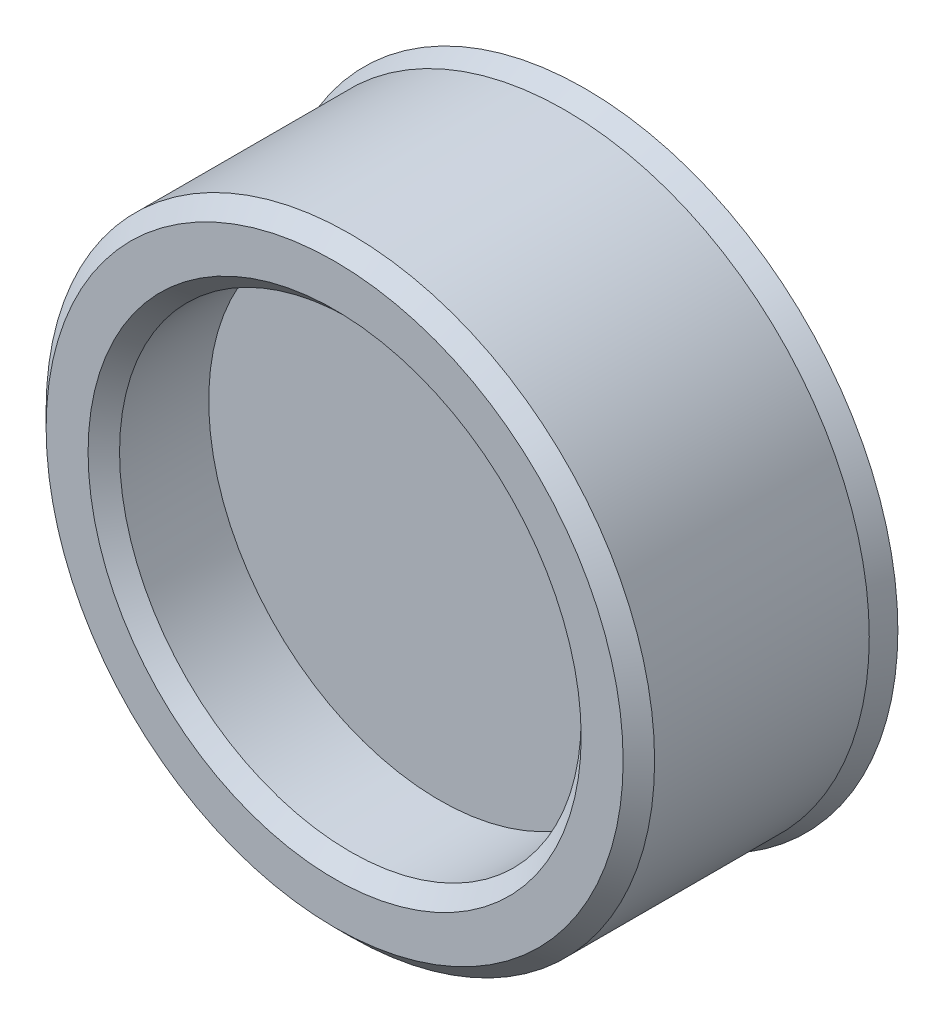
ISO-10303-21;
HEADER;
FILE_DESCRIPTION(('STEP AP214'),'2;1');
FILE_NAME('part.step','',(''),(''),'','','');
FILE_SCHEMA(('AUTOMOTIVE_DESIGN { 1 0 10303 214 1 1 1 1 }'));
ENDSEC;
DATA;
#1=APPLICATION_CONTEXT('core data for automotive mechanical design processes');
#2=APPLICATION_PROTOCOL_DEFINITION('international standard','automotive_design',2000,#1);
#3=PRODUCT_CONTEXT('',#1,'mechanical');
#4=PRODUCT('Part','Part','',(#3));
#5=PRODUCT_RELATED_PRODUCT_CATEGORY('part','',(#4));
#6=PRODUCT_DEFINITION_FORMATION('','',#4);
#7=PRODUCT_DEFINITION_CONTEXT('part definition',#1,'design');
#8=PRODUCT_DEFINITION('design','',#6,#7);
#9=PRODUCT_DEFINITION_SHAPE('','',#8);
#10=(LENGTH_UNIT() NAMED_UNIT(*) SI_UNIT(.MILLI.,.METRE.));
#11=(NAMED_UNIT(*) PLANE_ANGLE_UNIT() SI_UNIT($,.RADIAN.));
#12=(NAMED_UNIT(*) SI_UNIT($,.STERADIAN.) SOLID_ANGLE_UNIT());
#13=UNCERTAINTY_MEASURE_WITH_UNIT(LENGTH_MEASURE(1.E-05),#10,'distance_accuracy_value','');
#14=(GEOMETRIC_REPRESENTATION_CONTEXT(3) GLOBAL_UNCERTAINTY_ASSIGNED_CONTEXT((#13)) GLOBAL_UNIT_ASSIGNED_CONTEXT((#10,
#11,#12)) REPRESENTATION_CONTEXT('',''));
#15=CARTESIAN_POINT('',(0.,0.,0.));
#16=DIRECTION('',(0.,0.,1.));
#17=DIRECTION('',(1.,0.,0.));
#18=AXIS2_PLACEMENT_3D('',#15,#16,#17);
#19=CARTESIAN_POINT('',(12.49999934,6.49999934,2.33));
#20=DIRECTION('',(0.,0.,1.));
#21=DIRECTION('',(1.,0.,0.));
#22=AXIS2_PLACEMENT_3D('',#19,#20,#21);
#23=PLANE('',#22);
#24=CARTESIAN_POINT('',(12.49999934,6.49999934,2.33));
#25=DIRECTION('',(0.,0.,1.));
#26=DIRECTION('',(1.,0.,0.));
#27=AXIS2_PLACEMENT_3D('',#24,#25,#26);
#28=CIRCLE('',#27,2.2);
#29=CARTESIAN_POINT('',(14.69999934,6.49999934,2.33));
#30=VERTEX_POINT('',#29);
#31=EDGE_CURVE('E18',#30,#30,#28,.T.);
#32=ORIENTED_EDGE('',*,*,#31,.T.);
#33=EDGE_LOOP('',(#32));
#34=FACE_BOUND('',#33,.T.);
#35=ADVANCED_FACE('F15',(#34),#23,.T.);
#36=CARTESIAN_POINT('',(12.49999934,6.49999934,2.83));
#37=DIRECTION('',(0.,0.,1.));
#38=DIRECTION('',(1.,0.,0.));
#39=AXIS2_PLACEMENT_3D('',#36,#37,#38);
#40=CYLINDRICAL_SURFACE('',#39,2.2);
#41=ORIENTED_EDGE('',*,*,#31,.F.);
#42=EDGE_LOOP('',(#41));
#43=FACE_BOUND('',#42,.T.);
#44=CARTESIAN_POINT('',(12.49999934,6.49999934,3.17999999998619));
#45=DIRECTION('',(0.,0.,1.));
#46=DIRECTION('',(4.37113886762805E-08,-0.999999999999999,0.));
#47=AXIS2_PLACEMENT_3D('',#44,#45,#46);
#48=CIRCLE('',#47,2.19999999995146);
#49=CARTESIAN_POINT('',(12.4999994361651,4.29999934004854,3.17999999998619));
#50=VERTEX_POINT('',#49);
#51=EDGE_CURVE('E34',#50,#50,#48,.T.);
#52=ORIENTED_EDGE('',*,*,#51,.T.);
#53=EDGE_LOOP('',(#52));
#54=FACE_BOUND('',#53,.T.);
#55=ADVANCED_FACE('F51',(#43,#54),#40,.F.);
#56=CARTESIAN_POINT('',(12.49999934,6.49999934,3.32999999994854));
#57=DIRECTION('',(0.,0.,1.));
#58=DIRECTION('',(1.,0.,0.));
#59=AXIS2_PLACEMENT_3D('',#56,#57,#58);
#60=CONICAL_SURFACE('',#59,2.34999999997065,0.785398163586926);
#61=CARTESIAN_POINT('',(12.49999934,6.49999934,3.32999999995643));
#62=DIRECTION('',(0.,0.,1.));
#63=DIRECTION('',(1.,0.,0.));
#64=AXIS2_PLACEMENT_3D('',#61,#62,#63);
#65=CIRCLE('',#64,2.34999999997854);
#66=CARTESIAN_POINT('',(14.8499993399785,6.49999934,3.32999999995643));
#67=VERTEX_POINT('',#66);
#68=EDGE_CURVE('E37',#67,#67,#65,.F.);
#69=ORIENTED_EDGE('',*,*,#68,.F.);
#70=EDGE_LOOP('',(#69));
#71=FACE_BOUND('',#70,.T.);
#72=ORIENTED_EDGE('',*,*,#51,.F.);
#73=EDGE_LOOP('',(#72));
#74=FACE_BOUND('',#73,.T.);
#75=ADVANCED_FACE('F48',(#71,#74),#60,.F.);
#76=CARTESIAN_POINT('',(12.499999243835,8.69999934,3.33));
#77=DIRECTION('',(0.,0.,1.));
#78=DIRECTION('',(1.,0.,0.));
#79=AXIS2_PLACEMENT_3D('',#76,#77,#78);
#80=PLANE('',#79);
#81=ORIENTED_EDGE('',*,*,#68,.T.);
#82=EDGE_LOOP('',(#81));
#83=FACE_BOUND('',#82,.T.);
#84=CARTESIAN_POINT('',(12.49999934,6.49999934,3.3299999998917));
#85=DIRECTION('',(0.,0.,-1.));
#86=DIRECTION('',(-1.,0.,0.));
#87=AXIS2_PLACEMENT_3D('',#84,#85,#86);
#88=CIRCLE('',#87,2.74999999999971);
#89=CARTESIAN_POINT('',(9.74999934000029,6.49999934,3.3299999998917));
#90=VERTEX_POINT('',#89);
#91=EDGE_CURVE('E40',#90,#90,#88,.T.);
#92=ORIENTED_EDGE('',*,*,#91,.F.);
#93=EDGE_LOOP('',(#92));
#94=FACE_BOUND('',#93,.T.);
#95=ADVANCED_FACE('F45',(#83,#94),#80,.T.);
#96=CARTESIAN_POINT('',(12.499999209707,9.480753842139,0.942));
#97=DIRECTION('',(0.,0.,-1.));
#98=DIRECTION('',(-1.,0.,0.));
#99=AXIS2_PLACEMENT_3D('',#96,#97,#98);
#100=PLANE('',#99);
#101=CARTESIAN_POINT('',(12.49999934,6.49999934,0.942000000009102));
#102=DIRECTION('',(0.,0.,-1.));
#103=DIRECTION('',(-1.,0.,0.));
#104=AXIS2_PLACEMENT_3D('',#101,#102,#103);
#105=CIRCLE('',#104,2.98075450208898);
#106=CARTESIAN_POINT('',(9.51924483791102,6.49999934,0.942000000009102));
#107=VERTEX_POINT('',#106);
#108=EDGE_CURVE('E27',#107,#107,#105,.F.);
#109=ORIENTED_EDGE('',*,*,#108,.F.);
#110=EDGE_LOOP('',(#109));
#111=FACE_BOUND('',#110,.T.);
#112=ADVANCED_FACE('F77',(#111),#100,.T.);
#113=CARTESIAN_POINT('',(12.49999934,6.49999934,3.17999999992935));
#114=DIRECTION('',(0.,0.,-1.));
#115=DIRECTION('',(-1.,0.,0.));
#116=AXIS2_PLACEMENT_3D('',#113,#114,#115);
#117=CONICAL_SURFACE('',#116,2.89999999996205,0.785398163397448);
#118=CARTESIAN_POINT('',(12.49999934,6.49999934,3.18));
#119=DIRECTION('',(0.,0.,1.));
#120=DIRECTION('',(1.,0.,0.));
#121=AXIS2_PLACEMENT_3D('',#118,#119,#120);
#122=CIRCLE('',#121,2.9);
#123=CARTESIAN_POINT('',(15.39999934,6.49999934,3.18));
#124=VERTEX_POINT('',#123);
#125=EDGE_CURVE('E22',#124,#124,#122,.F.);
#126=ORIENTED_EDGE('',*,*,#125,.F.);
#127=EDGE_LOOP('',(#126));
#128=FACE_BOUND('',#127,.T.);
#129=ORIENTED_EDGE('',*,*,#91,.T.);
#130=EDGE_LOOP('',(#129));
#131=FACE_BOUND('',#130,.T.);
#132=ADVANCED_FACE('F70',(#128,#131),#117,.T.);
#133=CARTESIAN_POINT('',(12.49999934,6.49999934,0.942000000122789));
#134=DIRECTION('',(0.,0.,-1.));
#135=DIRECTION('',(-1.,0.,0.));
#136=AXIS2_PLACEMENT_3D('',#133,#134,#135);
#137=CONICAL_SURFACE('',#136,2.98075450204117,0.398094094164108);
#138=ORIENTED_EDGE('',*,*,#108,.T.);
#139=EDGE_LOOP('',(#138));
#140=FACE_BOUND('',#139,.T.);
#141=CARTESIAN_POINT('',(12.49999934,6.49999934,1.134021884414));
#142=DIRECTION('',(0.,0.,1.));
#143=DIRECTION('',(1.,0.,0.));
#144=AXIS2_PLACEMENT_3D('',#141,#142,#143);
#145=CIRCLE('',#144,2.9);
#146=CARTESIAN_POINT('',(15.39999934,6.49999934,1.134021884414));
#147=VERTEX_POINT('',#146);
#148=EDGE_CURVE('E10',#147,#147,#145,.T.);
#149=ORIENTED_EDGE('',*,*,#148,.F.);
#150=EDGE_LOOP('',(#149));
#151=FACE_BOUND('',#150,.T.);
#152=ADVANCED_FACE('F65',(#140,#151),#137,.T.);
#153=CARTESIAN_POINT('',(12.49999934,6.49999934,2.157010942207));
#154=DIRECTION('',(0.,0.,1.));
#155=DIRECTION('',(1.,0.,0.));
#156=AXIS2_PLACEMENT_3D('',#153,#154,#155);
#157=CYLINDRICAL_SURFACE('',#156,2.9);
#158=ORIENTED_EDGE('',*,*,#148,.T.);
#159=EDGE_LOOP('',(#158));
#160=FACE_BOUND('',#159,.T.);
#161=ORIENTED_EDGE('',*,*,#125,.T.);
#162=EDGE_LOOP('',(#161));
#163=FACE_BOUND('',#162,.T.);
#164=ADVANCED_FACE('F63',(#160,#163),#157,.T.);
#165=CLOSED_SHELL('',(#35,#55,#75,#95,#112,#132,#152,#164));
#166=MANIFOLD_SOLID_BREP('B1',#165);
#167=ADVANCED_BREP_SHAPE_REPRESENTATION('',(#18,#166),#14);
#168=SHAPE_DEFINITION_REPRESENTATION(#9,#167);
ENDSEC;
END-ISO-10303-21;
